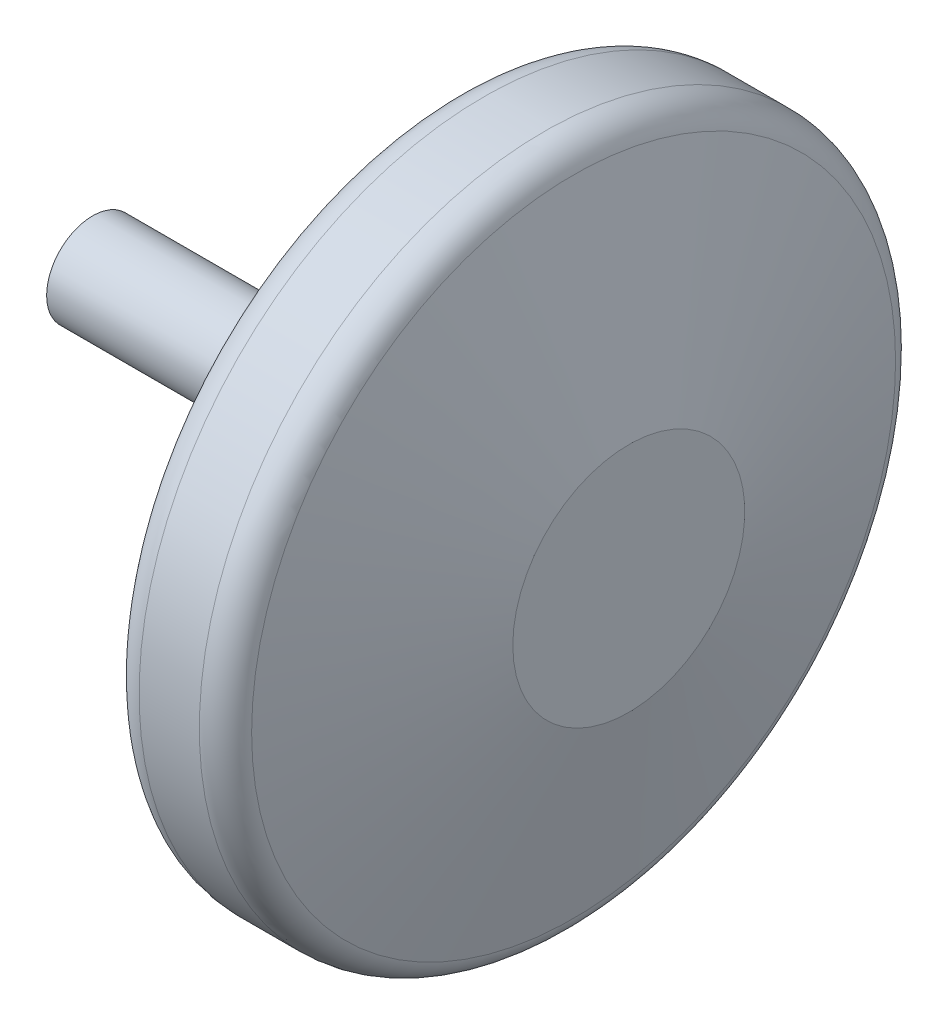
ISO-10303-21;
HEADER;
FILE_DESCRIPTION(('STEP AP214'),'2;1');
FILE_NAME('part.step','',(''),(''),'','','');
FILE_SCHEMA(('AUTOMOTIVE_DESIGN { 1 0 10303 214 1 1 1 1 }'));
ENDSEC;
DATA;
#1=APPLICATION_CONTEXT('core data for automotive mechanical design processes');
#2=APPLICATION_PROTOCOL_DEFINITION('international standard','automotive_design',2000,#1);
#3=PRODUCT_CONTEXT('',#1,'mechanical');
#4=PRODUCT('Part','Part','',(#3));
#5=PRODUCT_RELATED_PRODUCT_CATEGORY('part','',(#4));
#6=PRODUCT_DEFINITION_FORMATION('','',#4);
#7=PRODUCT_DEFINITION_CONTEXT('part definition',#1,'design');
#8=PRODUCT_DEFINITION('design','',#6,#7);
#9=PRODUCT_DEFINITION_SHAPE('','',#8);
#10=(LENGTH_UNIT() NAMED_UNIT(*) SI_UNIT(.MILLI.,.METRE.));
#11=(NAMED_UNIT(*) PLANE_ANGLE_UNIT() SI_UNIT($,.RADIAN.));
#12=(NAMED_UNIT(*) SI_UNIT($,.STERADIAN.) SOLID_ANGLE_UNIT());
#13=UNCERTAINTY_MEASURE_WITH_UNIT(LENGTH_MEASURE(1.E-05),#10,'distance_accuracy_value','');
#14=(GEOMETRIC_REPRESENTATION_CONTEXT(3) GLOBAL_UNCERTAINTY_ASSIGNED_CONTEXT((#13)) GLOBAL_UNIT_ASSIGNED_CONTEXT((#10,
#11,#12)) REPRESENTATION_CONTEXT('',''));
#15=CARTESIAN_POINT('',(0.,0.,0.));
#16=DIRECTION('',(0.,0.,1.));
#17=DIRECTION('',(1.,0.,0.));
#18=AXIS2_PLACEMENT_3D('',#15,#16,#17);
#19=CARTESIAN_POINT('',(0.,0.,0.));
#20=DIRECTION('',(1.,0.,0.));
#21=DIRECTION('',(0.,0.,-1.));
#22=AXIS2_PLACEMENT_3D('',#19,#20,#21);
#23=PLANE('',#22);
#24=CARTESIAN_POINT('',(0.,0.,0.));
#25=DIRECTION('',(-1.,0.,0.));
#26=DIRECTION('',(0.,0.,1.));
#27=AXIS2_PLACEMENT_3D('',#24,#25,#26);
#28=CIRCLE('',#27,3.);
#29=CARTESIAN_POINT('',(0.,0.,3.));
#30=VERTEX_POINT('',#29);
#31=EDGE_CURVE('E53',#30,#30,#28,.T.);
#32=ORIENTED_EDGE('',*,*,#31,.T.);
#33=EDGE_LOOP('',(#32));
#34=FACE_BOUND('',#33,.T.);
#35=ADVANCED_FACE('F33',(#34),#23,.F.);
#36=CARTESIAN_POINT('',(0.,0.,0.));
#37=DIRECTION('',(-1.,0.,0.));
#38=DIRECTION('',(0.,0.,1.));
#39=AXIS2_PLACEMENT_3D('',#36,#37,#38);
#40=CYLINDRICAL_SURFACE('',#39,3.);
#41=ORIENTED_EDGE('',*,*,#31,.F.);
#42=EDGE_LOOP('',(#41));
#43=FACE_BOUND('',#42,.T.);
#44=CARTESIAN_POINT('',(20.,0.,0.));
#45=DIRECTION('',(-1.,0.,0.));
#46=DIRECTION('',(0.,0.,1.));
#47=AXIS2_PLACEMENT_3D('',#44,#45,#46);
#48=CIRCLE('',#47,3.);
#49=CARTESIAN_POINT('',(20.,0.,3.));
#50=VERTEX_POINT('',#49);
#51=EDGE_CURVE('E56',#50,#50,#48,.T.);
#52=ORIENTED_EDGE('',*,*,#51,.T.);
#53=EDGE_LOOP('',(#52));
#54=FACE_BOUND('',#53,.T.);
#55=ADVANCED_FACE('F80',(#43,#54),#40,.T.);
#56=CARTESIAN_POINT('',(20.,3.,0.));
#57=DIRECTION('',(1.,0.,0.));
#58=DIRECTION('',(0.,0.,-1.));
#59=AXIS2_PLACEMENT_3D('',#56,#57,#58);
#60=PLANE('',#59);
#61=ORIENTED_EDGE('',*,*,#51,.F.);
#62=EDGE_LOOP('',(#61));
#63=FACE_BOUND('',#62,.T.);
#64=CARTESIAN_POINT('',(20.,0.,0.));
#65=DIRECTION('',(-1.,0.,0.));
#66=DIRECTION('',(0.,0.,1.));
#67=AXIS2_PLACEMENT_3D('',#64,#65,#66);
#68=CIRCLE('',#67,7.57179676972451);
#69=CARTESIAN_POINT('',(20.,0.,7.57179676972451));
#70=VERTEX_POINT('',#69);
#71=EDGE_CURVE('E59',#70,#70,#68,.T.);
#72=ORIENTED_EDGE('',*,*,#71,.T.);
#73=EDGE_LOOP('',(#72));
#74=FACE_BOUND('',#73,.T.);
#75=ADVANCED_FACE('F86',(#63,#74),#60,.F.);
#76=CARTESIAN_POINT('',(24.,0.,0.));
#77=DIRECTION('',(1.,0.,0.));
#78=DIRECTION('',(0.,0.,-1.));
#79=AXIS2_PLACEMENT_3D('',#76,#77,#78);
#80=CONICAL_SURFACE('',#79,22.5,1.30899693899575);
#81=CARTESIAN_POINT('',(23.6028023233798,0.,0.));
#82=DIRECTION('',(-1.,0.,0.));
#83=DIRECTION('',(0.,0.,1.));
#84=AXIS2_PLACEMENT_3D('',#81,#82,#83);
#85=CIRCLE('',#84,21.017638090205);
#86=CARTESIAN_POINT('',(23.6028023233798,0.,21.017638090205));
#87=VERTEX_POINT('',#86);
#88=EDGE_CURVE('E10',#87,#87,#85,.T.);
#89=ORIENTED_EDGE('',*,*,#88,.T.);
#90=EDGE_LOOP('',(#89));
#91=FACE_BOUND('',#90,.T.);
#92=ORIENTED_EDGE('',*,*,#71,.F.);
#93=EDGE_LOOP('',(#92));
#94=FACE_BOUND('',#93,.T.);
#95=ADVANCED_FACE('F92',(#91,#94),#80,.T.);
#96=CARTESIAN_POINT('',(0.,0.,0.));
#97=DIRECTION('',(-1.,0.,0.));
#98=DIRECTION('',(0.,0.,1.));
#99=AXIS2_PLACEMENT_3D('',#96,#97,#98);
#100=CYLINDRICAL_SURFACE('',#99,22.5);
#101=CARTESIAN_POINT('',(29.4653460240421,0.,0.));
#102=DIRECTION('',(1.,0.,0.));
#103=DIRECTION('',(0.,0.,-1.));
#104=AXIS2_PLACEMENT_3D('',#101,#102,#103);
#105=CIRCLE('',#104,22.5);
#106=CARTESIAN_POINT('',(29.4653460240421,0.,-22.5));
#107=VERTEX_POINT('',#106);
#108=EDGE_CURVE('E44',#107,#107,#105,.F.);
#109=ORIENTED_EDGE('',*,*,#108,.T.);
#110=EDGE_LOOP('',(#109));
#111=FACE_BOUND('',#110,.T.);
#112=CARTESIAN_POINT('',(25.5346539759579,0.,0.));
#113=DIRECTION('',(1.,0.,0.));
#114=DIRECTION('',(0.,0.,-1.));
#115=AXIS2_PLACEMENT_3D('',#112,#113,#114);
#116=CIRCLE('',#115,22.5);
#117=CARTESIAN_POINT('',(25.5346539759579,0.,-22.5));
#118=VERTEX_POINT('',#117);
#119=EDGE_CURVE('E48',#118,#118,#116,.T.);
#120=ORIENTED_EDGE('',*,*,#119,.T.);
#121=EDGE_LOOP('',(#120));
#122=FACE_BOUND('',#121,.T.);
#123=ADVANCED_FACE('F77',(#111,#122),#100,.T.);
#124=CARTESIAN_POINT('',(35.,0.,0.));
#125=DIRECTION('',(-1.,0.,0.));
#126=DIRECTION('',(0.,0.,1.));
#127=AXIS2_PLACEMENT_3D('',#124,#125,#126);
#128=CONICAL_SURFACE('',#127,7.57179676972411,1.30899693899575);
#129=CARTESIAN_POINT('',(31.3971976766202,0.,0.));
#130=DIRECTION('',(1.,0.,0.));
#131=DIRECTION('',(0.,0.,-1.));
#132=AXIS2_PLACEMENT_3D('',#129,#130,#131);
#133=CIRCLE('',#132,21.017638090205);
#134=CARTESIAN_POINT('',(31.3971976766202,0.,-21.017638090205));
#135=VERTEX_POINT('',#134);
#136=EDGE_CURVE('E40',#135,#135,#133,.T.);
#137=ORIENTED_EDGE('',*,*,#136,.T.);
#138=EDGE_LOOP('',(#137));
#139=FACE_BOUND('',#138,.T.);
#140=CARTESIAN_POINT('',(35.,0.,0.));
#141=DIRECTION('',(-1.,0.,0.));
#142=DIRECTION('',(0.,0.,1.));
#143=AXIS2_PLACEMENT_3D('',#140,#141,#142);
#144=CIRCLE('',#143,7.57179676972411);
#145=CARTESIAN_POINT('',(35.,0.,7.57179676972411));
#146=VERTEX_POINT('',#145);
#147=EDGE_CURVE('E62',#146,#146,#144,.T.);
#148=ORIENTED_EDGE('',*,*,#147,.T.);
#149=EDGE_LOOP('',(#148));
#150=FACE_BOUND('',#149,.T.);
#151=ADVANCED_FACE('F66',(#139,#150),#128,.T.);
#152=CARTESIAN_POINT('',(35.,7.57179676972411,0.));
#153=DIRECTION('',(-1.,0.,0.));
#154=DIRECTION('',(0.,0.,1.));
#155=AXIS2_PLACEMENT_3D('',#152,#153,#154);
#156=PLANE('',#155);
#157=ORIENTED_EDGE('',*,*,#147,.F.);
#158=EDGE_LOOP('',(#157));
#159=FACE_BOUND('',#158,.T.);
#160=ADVANCED_FACE('F68',(#159),#156,.F.);
#161=CARTESIAN_POINT('',(29.4653460240421,0.,0.));
#162=DIRECTION('',(1.,0.,0.));
#163=DIRECTION('',(0.,0.,-1.));
#164=AXIS2_PLACEMENT_3D('',#161,#162,#163);
#165=TOROIDAL_SURFACE('',#164,20.5,2.);
#166=ORIENTED_EDGE('',*,*,#136,.F.);
#167=EDGE_LOOP('',(#166));
#168=FACE_BOUND('',#167,.T.);
#169=ORIENTED_EDGE('',*,*,#108,.F.);
#170=EDGE_LOOP('',(#169));
#171=FACE_BOUND('',#170,.T.);
#172=ADVANCED_FACE('F70',(#168,#171),#165,.T.);
#173=CARTESIAN_POINT('',(25.5346539759579,0.,0.));
#174=DIRECTION('',(1.,0.,0.));
#175=DIRECTION('',(0.,0.,-1.));
#176=AXIS2_PLACEMENT_3D('',#173,#174,#175);
#177=TOROIDAL_SURFACE('',#176,20.5,2.);
#178=ORIENTED_EDGE('',*,*,#119,.F.);
#179=EDGE_LOOP('',(#178));
#180=FACE_BOUND('',#179,.T.);
#181=ORIENTED_EDGE('',*,*,#88,.F.);
#182=EDGE_LOOP('',(#181));
#183=FACE_BOUND('',#182,.T.);
#184=ADVANCED_FACE('F35',(#180,#183),#177,.T.);
#185=CLOSED_SHELL('',(#35,#55,#75,#95,#123,#151,#160,#172,#184));
#186=MANIFOLD_SOLID_BREP('B2',#185);
#187=ADVANCED_BREP_SHAPE_REPRESENTATION('',(#18,#186),#14);
#188=SHAPE_DEFINITION_REPRESENTATION(#9,#187);
ENDSEC;
END-ISO-10303-21;
